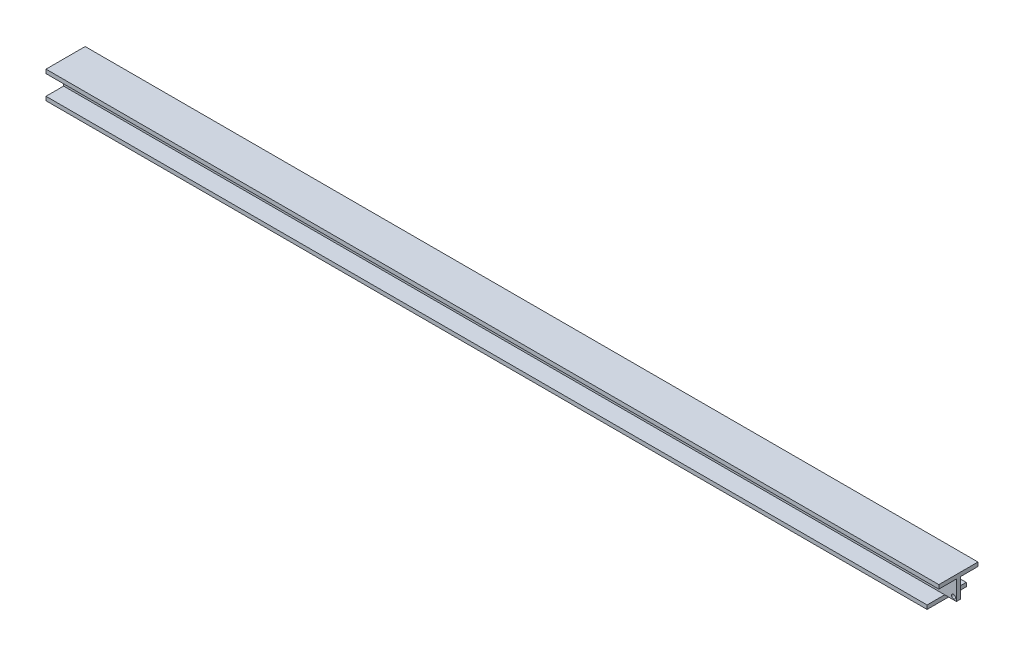
ISO-10303-21;
HEADER;
FILE_DESCRIPTION(('STEP AP214'),'2;1');
FILE_NAME('part.step','',(''),(''),'','','');
FILE_SCHEMA(('AUTOMOTIVE_DESIGN { 1 0 10303 214 1 1 1 1 }'));
ENDSEC;
DATA;
#1=APPLICATION_CONTEXT('core data for automotive mechanical design processes');
#2=APPLICATION_PROTOCOL_DEFINITION('international standard','automotive_design',2000,#1);
#3=PRODUCT_CONTEXT('',#1,'mechanical');
#4=PRODUCT('Part','Part','',(#3));
#5=PRODUCT_RELATED_PRODUCT_CATEGORY('part','',(#4));
#6=PRODUCT_DEFINITION_FORMATION('','',#4);
#7=PRODUCT_DEFINITION_CONTEXT('part definition',#1,'design');
#8=PRODUCT_DEFINITION('design','',#6,#7);
#9=PRODUCT_DEFINITION_SHAPE('','',#8);
#10=(LENGTH_UNIT() NAMED_UNIT(*) SI_UNIT(.MILLI.,.METRE.));
#11=(NAMED_UNIT(*) PLANE_ANGLE_UNIT() SI_UNIT($,.RADIAN.));
#12=(NAMED_UNIT(*) SI_UNIT($,.STERADIAN.) SOLID_ANGLE_UNIT());
#13=UNCERTAINTY_MEASURE_WITH_UNIT(LENGTH_MEASURE(1.E-05),#10,'distance_accuracy_value','');
#14=(GEOMETRIC_REPRESENTATION_CONTEXT(3) GLOBAL_UNCERTAINTY_ASSIGNED_CONTEXT((#13)) GLOBAL_UNIT_ASSIGNED_CONTEXT((#10,
#11,#12)) REPRESENTATION_CONTEXT('',''));
#15=CARTESIAN_POINT('',(0.,0.,0.));
#16=DIRECTION('',(0.,0.,1.));
#17=DIRECTION('',(1.,0.,0.));
#18=AXIS2_PLACEMENT_3D('',#15,#16,#17);
#19=CARTESIAN_POINT('',(1930.4,-127.,0.));
#20=DIRECTION('',(0.,-1.,0.));
#21=DIRECTION('',(0.,0.,-1.));
#22=AXIS2_PLACEMENT_3D('',#19,#20,#21);
#23=PLANE('',#22);
#24=DIRECTION('',(0.,0.,1.));
#25=VECTOR('',#24,1.);
#26=CARTESIAN_POINT('',(1854.2,-127.,0.));
#27=LINE('',#26,#25);
#28=CARTESIAN_POINT('',(1854.2,-127.,-114.3));
#29=VERTEX_POINT('',#28);
#30=CARTESIAN_POINT('',(1854.2,-127.,0.));
#31=VERTEX_POINT('',#30);
#32=EDGE_CURVE('E187',#29,#31,#27,.T.);
#33=ORIENTED_EDGE('',*,*,#32,.F.);
#34=DIRECTION('',(-1.,0.,0.));
#35=VECTOR('',#34,1.);
#36=CARTESIAN_POINT('',(1930.4,-127.,-114.3));
#37=LINE('',#36,#35);
#38=CARTESIAN_POINT('',(-3860.8,-127.,-114.3));
#39=VERTEX_POINT('',#38);
#40=EDGE_CURVE('E227',#29,#39,#37,.T.);
#41=ORIENTED_EDGE('',*,*,#40,.T.);
#42=DIRECTION('',(0.,0.,-1.));
#43=VECTOR('',#42,1.);
#44=CARTESIAN_POINT('',(-3860.8,-127.,-114.3));
#45=LINE('',#44,#43);
#46=CARTESIAN_POINT('',(-3860.8,-127.,0.));
#47=VERTEX_POINT('',#46);
#48=EDGE_CURVE('E169',#47,#39,#45,.T.);
#49=ORIENTED_EDGE('',*,*,#48,.F.);
#50=DIRECTION('',(-1.,0.,0.));
#51=VECTOR('',#50,1.);
#52=CARTESIAN_POINT('',(1930.4,-127.,0.));
#53=LINE('',#52,#51);
#54=EDGE_CURVE('E225',#31,#47,#53,.T.);
#55=ORIENTED_EDGE('',*,*,#54,.F.);
#56=EDGE_LOOP('',(#33,#41,#49,#55));
#57=FACE_BOUND('',#56,.T.);
#58=ADVANCED_FACE('F35',(#57),#23,.F.);
#59=CARTESIAN_POINT('',(1930.4,-127.,0.));
#60=DIRECTION('',(0.,0.,-1.));
#61=DIRECTION('',(0.,1.,0.));
#62=AXIS2_PLACEMENT_3D('',#59,#60,#61);
#63=PLANE('',#62);
#64=DIRECTION('',(0.,-1.,0.));
#65=VECTOR('',#64,1.);
#66=CARTESIAN_POINT('',(1854.2,-127.,0.));
#67=LINE('',#66,#65);
#68=CARTESIAN_POINT('',(1854.2,-152.4,0.));
#69=VERTEX_POINT('',#68);
#70=EDGE_CURVE('E181',#31,#69,#67,.T.);
#71=ORIENTED_EDGE('',*,*,#70,.F.);
#72=ORIENTED_EDGE('',*,*,#54,.T.);
#73=DIRECTION('',(0.,1.,0.));
#74=VECTOR('',#73,1.);
#75=CARTESIAN_POINT('',(-3860.8,-127.,0.));
#76=LINE('',#75,#74);
#77=CARTESIAN_POINT('',(-3860.8,-152.4,0.));
#78=VERTEX_POINT('',#77);
#79=EDGE_CURVE('E166',#78,#47,#76,.T.);
#80=ORIENTED_EDGE('',*,*,#79,.F.);
#81=DIRECTION('',(-1.,0.,0.));
#82=VECTOR('',#81,1.);
#83=CARTESIAN_POINT('',(1930.4,-152.4,0.));
#84=LINE('',#83,#82);
#85=EDGE_CURVE('E223',#69,#78,#84,.T.);
#86=ORIENTED_EDGE('',*,*,#85,.F.);
#87=EDGE_LOOP('',(#71,#72,#80,#86));
#88=FACE_BOUND('',#87,.T.);
#89=ADVANCED_FACE('F254',(#88),#63,.F.);
#90=CARTESIAN_POINT('',(1930.4,-152.4,0.));
#91=DIRECTION('',(0.,1.,0.));
#92=DIRECTION('',(0.,0.,1.));
#93=AXIS2_PLACEMENT_3D('',#90,#91,#92);
#94=PLANE('',#93);
#95=DIRECTION('',(0.,0.,-1.));
#96=VECTOR('',#95,1.);
#97=CARTESIAN_POINT('',(1854.2,-152.4,0.));
#98=LINE('',#97,#96);
#99=CARTESIAN_POINT('',(1854.2,-152.4,-254.));
#100=VERTEX_POINT('',#99);
#101=EDGE_CURVE('E183',#69,#100,#98,.T.);
#102=ORIENTED_EDGE('',*,*,#101,.F.);
#103=ORIENTED_EDGE('',*,*,#85,.T.);
#104=DIRECTION('',(0.,0.,1.));
#105=VECTOR('',#104,1.);
#106=CARTESIAN_POINT('',(-3860.8,-152.4,0.));
#107=LINE('',#106,#105);
#108=CARTESIAN_POINT('',(-3860.8,-152.4,-254.));
#109=VERTEX_POINT('',#108);
#110=EDGE_CURVE('E163',#109,#78,#107,.T.);
#111=ORIENTED_EDGE('',*,*,#110,.F.);
#112=DIRECTION('',(-1.,0.,0.));
#113=VECTOR('',#112,1.);
#114=CARTESIAN_POINT('',(1930.4,-152.4,-254.));
#115=LINE('',#114,#113);
#116=EDGE_CURVE('E221',#100,#109,#115,.T.);
#117=ORIENTED_EDGE('',*,*,#116,.F.);
#118=EDGE_LOOP('',(#102,#103,#111,#117));
#119=FACE_BOUND('',#118,.T.);
#120=ADVANCED_FACE('F261',(#119),#94,.F.);
#121=CARTESIAN_POINT('',(1930.4,-127.,-254.));
#122=DIRECTION('',(0.,0.,1.));
#123=DIRECTION('',(1.,0.,0.));
#124=AXIS2_PLACEMENT_3D('',#121,#122,#123);
#125=PLANE('',#124);
#126=DIRECTION('',(0.,1.,0.));
#127=VECTOR('',#126,1.);
#128=CARTESIAN_POINT('',(1854.2,-127.,-254.));
#129=LINE('',#128,#127);
#130=CARTESIAN_POINT('',(1854.2,-127.,-254.));
#131=VERTEX_POINT('',#130);
#132=EDGE_CURVE('E185',#100,#131,#129,.T.);
#133=ORIENTED_EDGE('',*,*,#132,.F.);
#134=ORIENTED_EDGE('',*,*,#116,.T.);
#135=DIRECTION('',(0.,-1.,0.));
#136=VECTOR('',#135,1.);
#137=CARTESIAN_POINT('',(-3860.8,-152.4,-254.));
#138=LINE('',#137,#136);
#139=CARTESIAN_POINT('',(-3860.8,-127.,-254.));
#140=VERTEX_POINT('',#139);
#141=EDGE_CURVE('E160',#140,#109,#138,.T.);
#142=ORIENTED_EDGE('',*,*,#141,.F.);
#143=DIRECTION('',(-1.,0.,0.));
#144=VECTOR('',#143,1.);
#145=CARTESIAN_POINT('',(1930.4,-127.,-254.));
#146=LINE('',#145,#144);
#147=EDGE_CURVE('E219',#131,#140,#146,.T.);
#148=ORIENTED_EDGE('',*,*,#147,.F.);
#149=EDGE_LOOP('',(#133,#134,#142,#148));
#150=FACE_BOUND('',#149,.T.);
#151=ADVANCED_FACE('F279',(#150),#125,.F.);
#152=CARTESIAN_POINT('',(1930.4,-127.,-139.7));
#153=DIRECTION('',(0.,-1.,0.));
#154=DIRECTION('',(0.,0.,-1.));
#155=AXIS2_PLACEMENT_3D('',#152,#153,#154);
#156=PLANE('',#155);
#157=CARTESIAN_POINT('',(1854.2,-127.,-139.7));
#158=VERTEX_POINT('',#157);
#159=EDGE_CURVE('E188',#131,#158,#27,.T.);
#160=ORIENTED_EDGE('',*,*,#159,.F.);
#161=ORIENTED_EDGE('',*,*,#147,.T.);
#162=DIRECTION('',(0.,0.,-1.));
#163=VECTOR('',#162,1.);
#164=CARTESIAN_POINT('',(-3860.8,-127.,-254.));
#165=LINE('',#164,#163);
#166=CARTESIAN_POINT('',(-3860.8,-127.,-139.7));
#167=VERTEX_POINT('',#166);
#168=EDGE_CURVE('E157',#167,#140,#165,.T.);
#169=ORIENTED_EDGE('',*,*,#168,.F.);
#170=DIRECTION('',(-1.,0.,0.));
#171=VECTOR('',#170,1.);
#172=CARTESIAN_POINT('',(1930.4,-127.,-139.7));
#173=LINE('',#172,#171);
#174=EDGE_CURVE('E215',#158,#167,#173,.T.);
#175=ORIENTED_EDGE('',*,*,#174,.F.);
#176=EDGE_LOOP('',(#160,#161,#169,#175));
#177=FACE_BOUND('',#176,.T.);
#178=ADVANCED_FACE('F275',(#177),#156,.F.);
#179=CARTESIAN_POINT('',(1930.4,0.,0.));
#180=DIRECTION('',(0.,0.,-1.));
#181=DIRECTION('',(-1.,0.,0.));
#182=AXIS2_PLACEMENT_3D('',#179,#180,#181);
#183=PLANE('',#182);
#184=DIRECTION('',(-1.,0.,0.));
#185=VECTOR('',#184,1.);
#186=CARTESIAN_POINT('',(1930.4,25.4,0.));
#187=LINE('',#186,#185);
#188=CARTESIAN_POINT('',(1930.4,25.4,0.));
#189=VERTEX_POINT('',#188);
#190=CARTESIAN_POINT('',(-3860.8,25.4,0.));
#191=VERTEX_POINT('',#190);
#192=EDGE_CURVE('E211',#189,#191,#187,.T.);
#193=ORIENTED_EDGE('',*,*,#192,.T.);
#194=DIRECTION('',(0.,1.,0.));
#195=VECTOR('',#194,1.);
#196=CARTESIAN_POINT('',(-3860.8,25.4,0.));
#197=LINE('',#196,#195);
#198=CARTESIAN_POINT('',(-3860.8,0.,0.));
#199=VERTEX_POINT('',#198);
#200=EDGE_CURVE('E178',#199,#191,#197,.T.);
#201=ORIENTED_EDGE('',*,*,#200,.F.);
#202=DIRECTION('',(-1.,0.,0.));
#203=VECTOR('',#202,1.);
#204=CARTESIAN_POINT('',(1930.4,0.,0.));
#205=LINE('',#204,#203);
#206=CARTESIAN_POINT('',(1930.4,0.,0.));
#207=VERTEX_POINT('',#206);
#208=EDGE_CURVE('E43',#207,#199,#205,.T.);
#209=ORIENTED_EDGE('',*,*,#208,.F.);
#210=DIRECTION('',(0.,-1.,0.));
#211=VECTOR('',#210,1.);
#212=CARTESIAN_POINT('',(1930.4,0.,0.));
#213=LINE('',#212,#211);
#214=EDGE_CURVE('E198',#189,#207,#213,.T.);
#215=ORIENTED_EDGE('',*,*,#214,.F.);
#216=EDGE_LOOP('',(#193,#201,#209,#215));
#217=FACE_BOUND('',#216,.T.);
#218=ADVANCED_FACE('F37',(#217),#183,.F.);
#219=CARTESIAN_POINT('',(1930.4,0.,0.));
#220=DIRECTION('',(0.,1.,0.));
#221=DIRECTION('',(0.,0.,1.));
#222=AXIS2_PLACEMENT_3D('',#219,#220,#221);
#223=PLANE('',#222);
#224=ORIENTED_EDGE('',*,*,#208,.T.);
#225=DIRECTION('',(0.,0.,1.));
#226=VECTOR('',#225,1.);
#227=CARTESIAN_POINT('',(-3860.8,0.,0.));
#228=LINE('',#227,#226);
#229=CARTESIAN_POINT('',(-3860.8,0.,-114.3));
#230=VERTEX_POINT('',#229);
#231=EDGE_CURVE('E175',#230,#199,#228,.T.);
#232=ORIENTED_EDGE('',*,*,#231,.F.);
#233=DIRECTION('',(-1.,0.,0.));
#234=VECTOR('',#233,1.);
#235=CARTESIAN_POINT('',(1930.4,0.,-114.3));
#236=LINE('',#235,#234);
#237=CARTESIAN_POINT('',(1930.4,0.,-114.3));
#238=VERTEX_POINT('',#237);
#239=EDGE_CURVE('E230',#238,#230,#236,.T.);
#240=ORIENTED_EDGE('',*,*,#239,.F.);
#241=DIRECTION('',(0.,0.,-1.));
#242=VECTOR('',#241,1.);
#243=CARTESIAN_POINT('',(1930.4,0.,0.));
#244=LINE('',#243,#242);
#245=EDGE_CURVE('E200',#207,#238,#244,.T.);
#246=ORIENTED_EDGE('',*,*,#245,.F.);
#247=EDGE_LOOP('',(#224,#232,#240,#246));
#248=FACE_BOUND('',#247,.T.);
#249=ADVANCED_FACE('F234',(#248),#223,.F.);
#250=CARTESIAN_POINT('',(1930.4,0.,-114.3));
#251=DIRECTION('',(0.,0.,-1.));
#252=DIRECTION('',(-1.,0.,0.));
#253=AXIS2_PLACEMENT_3D('',#250,#251,#252);
#254=PLANE('',#253);
#255=CARTESIAN_POINT('',(1911.35,-107.95,-114.3));
#256=DIRECTION('',(0.,0.,1.));
#257=DIRECTION('',(1.,0.,0.));
#258=AXIS2_PLACEMENT_3D('',#255,#256,#257);
#259=CIRCLE('',#258,12.6999999999994);
#260=CARTESIAN_POINT('',(1924.05,-107.95,-114.3));
#261=VERTEX_POINT('',#260);
#262=EDGE_CURVE('E191',#261,#261,#259,.T.);
#263=ORIENTED_EDGE('',*,*,#262,.F.);
#264=EDGE_LOOP('',(#263));
#265=FACE_BOUND('',#264,.T.);
#266=ORIENTED_EDGE('',*,*,#239,.T.);
#267=DIRECTION('',(0.,1.,0.));
#268=VECTOR('',#267,1.);
#269=CARTESIAN_POINT('',(-3860.8,0.,-114.3));
#270=LINE('',#269,#268);
#271=EDGE_CURVE('E172',#39,#230,#270,.T.);
#272=ORIENTED_EDGE('',*,*,#271,.F.);
#273=ORIENTED_EDGE('',*,*,#40,.F.);
#274=CARTESIAN_POINT('',(1930.4,-127.,-114.3));
#275=VERTEX_POINT('',#274);
#276=EDGE_CURVE('E228',#275,#29,#37,.T.);
#277=ORIENTED_EDGE('',*,*,#276,.F.);
#278=DIRECTION('',(0.,-1.,0.));
#279=VECTOR('',#278,1.);
#280=CARTESIAN_POINT('',(1930.4,0.,-114.3));
#281=LINE('',#280,#279);
#282=EDGE_CURVE('E202',#238,#275,#281,.T.);
#283=ORIENTED_EDGE('',*,*,#282,.F.);
#284=EDGE_LOOP('',(#266,#272,#273,#277,#283));
#285=FACE_BOUND('',#284,.T.);
#286=ADVANCED_FACE('F267',(#265,#285),#254,.F.);
#287=CARTESIAN_POINT('',(1930.4,0.,-139.7));
#288=DIRECTION('',(0.,0.,1.));
#289=DIRECTION('',(1.,0.,0.));
#290=AXIS2_PLACEMENT_3D('',#287,#288,#289);
#291=PLANE('',#290);
#292=CARTESIAN_POINT('',(1911.35,-107.95,-139.7));
#293=DIRECTION('',(0.,0.,1.));
#294=DIRECTION('',(1.,0.,0.));
#295=AXIS2_PLACEMENT_3D('',#292,#293,#294);
#296=CIRCLE('',#295,12.6999999999994);
#297=CARTESIAN_POINT('',(1924.05,-107.95,-139.7));
#298=VERTEX_POINT('',#297);
#299=EDGE_CURVE('E195',#298,#298,#296,.F.);
#300=ORIENTED_EDGE('',*,*,#299,.F.);
#301=EDGE_LOOP('',(#300));
#302=FACE_BOUND('',#301,.T.);
#303=ORIENTED_EDGE('',*,*,#174,.T.);
#304=DIRECTION('',(0.,-1.,0.));
#305=VECTOR('',#304,1.);
#306=CARTESIAN_POINT('',(-3860.8,-127.,-139.7));
#307=LINE('',#306,#305);
#308=CARTESIAN_POINT('',(-3860.8,0.,-139.7));
#309=VERTEX_POINT('',#308);
#310=EDGE_CURVE('E147',#309,#167,#307,.T.);
#311=ORIENTED_EDGE('',*,*,#310,.F.);
#312=DIRECTION('',(-1.,0.,0.));
#313=VECTOR('',#312,1.);
#314=CARTESIAN_POINT('',(1930.4,0.,-139.7));
#315=LINE('',#314,#313);
#316=CARTESIAN_POINT('',(1930.4,0.,-139.7));
#317=VERTEX_POINT('',#316);
#318=EDGE_CURVE('E137',#317,#309,#315,.T.);
#319=ORIENTED_EDGE('',*,*,#318,.F.);
#320=DIRECTION('',(0.,1.,0.));
#321=VECTOR('',#320,1.);
#322=CARTESIAN_POINT('',(1930.4,0.,-139.7));
#323=LINE('',#322,#321);
#324=CARTESIAN_POINT('',(1930.4,-127.,-139.7));
#325=VERTEX_POINT('',#324);
#326=EDGE_CURVE('E205',#325,#317,#323,.T.);
#327=ORIENTED_EDGE('',*,*,#326,.F.);
#328=EDGE_CURVE('E216',#325,#158,#173,.T.);
#329=ORIENTED_EDGE('',*,*,#328,.T.);
#330=EDGE_LOOP('',(#303,#311,#319,#327,#329));
#331=FACE_BOUND('',#330,.T.);
#332=ADVANCED_FACE('F269',(#302,#331),#291,.F.);
#333=CARTESIAN_POINT('',(1930.4,0.,-139.7));
#334=DIRECTION('',(0.,1.,0.));
#335=DIRECTION('',(0.,0.,1.));
#336=AXIS2_PLACEMENT_3D('',#333,#334,#335);
#337=PLANE('',#336);
#338=ORIENTED_EDGE('',*,*,#318,.T.);
#339=DIRECTION('',(0.,0.,1.));
#340=VECTOR('',#339,1.);
#341=CARTESIAN_POINT('',(-3860.8,0.,-139.7));
#342=LINE('',#341,#340);
#343=CARTESIAN_POINT('',(-3860.8,0.,-254.));
#344=VERTEX_POINT('',#343);
#345=EDGE_CURVE('E141',#344,#309,#342,.T.);
#346=ORIENTED_EDGE('',*,*,#345,.F.);
#347=DIRECTION('',(-1.,0.,0.));
#348=VECTOR('',#347,1.);
#349=CARTESIAN_POINT('',(1930.4,0.,-254.));
#350=LINE('',#349,#348);
#351=CARTESIAN_POINT('',(1930.4,0.,-254.));
#352=VERTEX_POINT('',#351);
#353=EDGE_CURVE('E130',#352,#344,#350,.T.);
#354=ORIENTED_EDGE('',*,*,#353,.F.);
#355=DIRECTION('',(0.,0.,-1.));
#356=VECTOR('',#355,1.);
#357=CARTESIAN_POINT('',(1930.4,0.,-139.7));
#358=LINE('',#357,#356);
#359=EDGE_CURVE('E207',#317,#352,#358,.T.);
#360=ORIENTED_EDGE('',*,*,#359,.F.);
#361=EDGE_LOOP('',(#338,#346,#354,#360));
#362=FACE_BOUND('',#361,.T.);
#363=ADVANCED_FACE('F142',(#362),#337,.F.);
#364=CARTESIAN_POINT('',(1930.4,0.,-254.));
#365=DIRECTION('',(0.,0.,1.));
#366=DIRECTION('',(1.,0.,0.));
#367=AXIS2_PLACEMENT_3D('',#364,#365,#366);
#368=PLANE('',#367);
#369=ORIENTED_EDGE('',*,*,#353,.T.);
#370=DIRECTION('',(0.,-1.,0.));
#371=VECTOR('',#370,1.);
#372=CARTESIAN_POINT('',(-3860.8,0.,-254.));
#373=LINE('',#372,#371);
#374=CARTESIAN_POINT('',(-3860.8,25.4,-254.));
#375=VERTEX_POINT('',#374);
#376=EDGE_CURVE('E134',#375,#344,#373,.T.);
#377=ORIENTED_EDGE('',*,*,#376,.F.);
#378=DIRECTION('',(-1.,0.,0.));
#379=VECTOR('',#378,1.);
#380=CARTESIAN_POINT('',(1930.4,25.4,-254.));
#381=LINE('',#380,#379);
#382=CARTESIAN_POINT('',(1930.4,25.4,-254.));
#383=VERTEX_POINT('',#382);
#384=EDGE_CURVE('E138',#383,#375,#381,.T.);
#385=ORIENTED_EDGE('',*,*,#384,.F.);
#386=DIRECTION('',(0.,1.,0.));
#387=VECTOR('',#386,1.);
#388=CARTESIAN_POINT('',(1930.4,0.,-254.));
#389=LINE('',#388,#387);
#390=EDGE_CURVE('E55',#352,#383,#389,.T.);
#391=ORIENTED_EDGE('',*,*,#390,.F.);
#392=EDGE_LOOP('',(#369,#377,#385,#391));
#393=FACE_BOUND('',#392,.T.);
#394=ADVANCED_FACE('F132',(#393),#368,.F.);
#395=CARTESIAN_POINT('',(1930.4,25.4,0.));
#396=DIRECTION('',(0.,-1.,0.));
#397=DIRECTION('',(0.,0.,-1.));
#398=AXIS2_PLACEMENT_3D('',#395,#396,#397);
#399=PLANE('',#398);
#400=ORIENTED_EDGE('',*,*,#384,.T.);
#401=DIRECTION('',(0.,0.,-1.));
#402=VECTOR('',#401,1.);
#403=CARTESIAN_POINT('',(-3860.8,25.4,-254.));
#404=LINE('',#403,#402);
#405=EDGE_CURVE('E153',#191,#375,#404,.T.);
#406=ORIENTED_EDGE('',*,*,#405,.F.);
#407=ORIENTED_EDGE('',*,*,#192,.F.);
#408=DIRECTION('',(0.,0.,1.));
#409=VECTOR('',#408,1.);
#410=CARTESIAN_POINT('',(1930.4,25.4,0.));
#411=LINE('',#410,#409);
#412=EDGE_CURVE('E50',#383,#189,#411,.T.);
#413=ORIENTED_EDGE('',*,*,#412,.F.);
#414=EDGE_LOOP('',(#400,#406,#407,#413));
#415=FACE_BOUND('',#414,.T.);
#416=ADVANCED_FACE('F241',(#415),#399,.F.);
#417=CARTESIAN_POINT('',(1930.4,0.,0.));
#418=DIRECTION('',(-1.,0.,0.));
#419=DIRECTION('',(0.,0.,1.));
#420=AXIS2_PLACEMENT_3D('',#417,#418,#419);
#421=PLANE('',#420);
#422=ORIENTED_EDGE('',*,*,#282,.T.);
#423=DIRECTION('',(0.,0.,-1.));
#424=VECTOR('',#423,1.);
#425=CARTESIAN_POINT('',(1930.4,-127.,0.));
#426=LINE('',#425,#424);
#427=EDGE_CURVE('E11',#275,#325,#426,.T.);
#428=ORIENTED_EDGE('',*,*,#427,.T.);
#429=ORIENTED_EDGE('',*,*,#326,.T.);
#430=ORIENTED_EDGE('',*,*,#359,.T.);
#431=ORIENTED_EDGE('',*,*,#390,.T.);
#432=ORIENTED_EDGE('',*,*,#412,.T.);
#433=ORIENTED_EDGE('',*,*,#214,.T.);
#434=ORIENTED_EDGE('',*,*,#245,.T.);
#435=EDGE_LOOP('',(#422,#428,#429,#430,#431,#432,#433,#434));
#436=FACE_BOUND('',#435,.T.);
#437=ADVANCED_FACE('F243',(#436),#421,.F.);
#438=CARTESIAN_POINT('',(1911.35,-107.95,-254.001));
#439=DIRECTION('',(0.,0.,1.));
#440=DIRECTION('',(1.,0.,0.));
#441=AXIS2_PLACEMENT_3D('',#438,#439,#440);
#442=CYLINDRICAL_SURFACE('',#441,12.6999999999994);
#443=CARTESIAN_POINT('',(1924.05,-107.95,-114.3));
#444=CARTESIAN_POINT('',(1924.05,-107.95,-114.564583333333));
#445=CARTESIAN_POINT('',(1924.05,-107.95,-114.829166666667));
#446=CARTESIAN_POINT('',(1924.05,-107.95,-115.358333333333));
#447=CARTESIAN_POINT('',(1924.05,-107.95,-115.622916666667));
#448=CARTESIAN_POINT('',(1924.05,-107.95,-116.152083333333));
#449=CARTESIAN_POINT('',(1924.05,-107.95,-116.416666666667));
#450=CARTESIAN_POINT('',(1924.05,-107.95,-116.945833333333));
#451=CARTESIAN_POINT('',(1924.05,-107.95,-117.210416666667));
#452=CARTESIAN_POINT('',(1924.05,-107.95,-117.739583333333));
#453=CARTESIAN_POINT('',(1924.05,-107.95,-118.004166666667));
#454=CARTESIAN_POINT('',(1924.05,-107.95,-118.533333333333));
#455=CARTESIAN_POINT('',(1924.05,-107.95,-118.797916666667));
#456=CARTESIAN_POINT('',(1924.05,-107.95,-119.327083333333));
#457=CARTESIAN_POINT('',(1924.05,-107.95,-119.591666666667));
#458=CARTESIAN_POINT('',(1924.05,-107.95,-120.120833333333));
#459=CARTESIAN_POINT('',(1924.05,-107.95,-120.385416666667));
#460=CARTESIAN_POINT('',(1924.05,-107.95,-120.914583333333));
#461=CARTESIAN_POINT('',(1924.05,-107.95,-121.179166666667));
#462=CARTESIAN_POINT('',(1924.05,-107.95,-121.708333333333));
#463=CARTESIAN_POINT('',(1924.05,-107.95,-121.972916666667));
#464=CARTESIAN_POINT('',(1924.05,-107.95,-122.502083333333));
#465=CARTESIAN_POINT('',(1924.05,-107.95,-122.766666666667));
#466=CARTESIAN_POINT('',(1924.05,-107.95,-123.295833333333));
#467=CARTESIAN_POINT('',(1924.05,-107.95,-123.560416666667));
#468=CARTESIAN_POINT('',(1924.05,-107.95,-124.089583333333));
#469=CARTESIAN_POINT('',(1924.05,-107.95,-124.354166666667));
#470=CARTESIAN_POINT('',(1924.05,-107.95,-124.883333333333));
#471=CARTESIAN_POINT('',(1924.05,-107.95,-125.147916666667));
#472=CARTESIAN_POINT('',(1924.05,-107.95,-125.677083333333));
#473=CARTESIAN_POINT('',(1924.05,-107.95,-125.941666666667));
#474=CARTESIAN_POINT('',(1924.05,-107.95,-126.470833333333));
#475=CARTESIAN_POINT('',(1924.05,-107.95,-126.735416666667));
#476=CARTESIAN_POINT('',(1924.05,-107.95,-127.264583333333));
#477=CARTESIAN_POINT('',(1924.05,-107.95,-127.529166666667));
#478=CARTESIAN_POINT('',(1924.05,-107.95,-128.058333333333));
#479=CARTESIAN_POINT('',(1924.05,-107.95,-128.322916666667));
#480=CARTESIAN_POINT('',(1924.05,-107.95,-128.852083333333));
#481=CARTESIAN_POINT('',(1924.05,-107.95,-129.116666666667));
#482=CARTESIAN_POINT('',(1924.05,-107.95,-129.645833333333));
#483=CARTESIAN_POINT('',(1924.05,-107.95,-129.910416666667));
#484=CARTESIAN_POINT('',(1924.05,-107.95,-130.439583333333));
#485=CARTESIAN_POINT('',(1924.05,-107.95,-130.704166666667));
#486=CARTESIAN_POINT('',(1924.05,-107.95,-131.233333333333));
#487=CARTESIAN_POINT('',(1924.05,-107.95,-131.497916666667));
#488=CARTESIAN_POINT('',(1924.05,-107.95,-132.027083333333));
#489=CARTESIAN_POINT('',(1924.05,-107.95,-132.291666666667));
#490=CARTESIAN_POINT('',(1924.05,-107.95,-132.820833333333));
#491=CARTESIAN_POINT('',(1924.05,-107.95,-133.085416666667));
#492=CARTESIAN_POINT('',(1924.05,-107.95,-133.614583333333));
#493=CARTESIAN_POINT('',(1924.05,-107.95,-133.879166666667));
#494=CARTESIAN_POINT('',(1924.05,-107.95,-134.408333333333));
#495=CARTESIAN_POINT('',(1924.05,-107.95,-134.672916666667));
#496=CARTESIAN_POINT('',(1924.05,-107.95,-135.202083333333));
#497=CARTESIAN_POINT('',(1924.05,-107.95,-135.466666666667));
#498=CARTESIAN_POINT('',(1924.05,-107.95,-135.995833333333));
#499=CARTESIAN_POINT('',(1924.05,-107.95,-136.260416666667));
#500=CARTESIAN_POINT('',(1924.05,-107.95,-136.789583333333));
#501=CARTESIAN_POINT('',(1924.05,-107.95,-137.054166666667));
#502=CARTESIAN_POINT('',(1924.05,-107.95,-137.583333333333));
#503=CARTESIAN_POINT('',(1924.05,-107.95,-137.847916666667));
#504=CARTESIAN_POINT('',(1924.05,-107.95,-138.377083333333));
#505=CARTESIAN_POINT('',(1924.05,-107.95,-138.641666666667));
#506=CARTESIAN_POINT('',(1924.05,-107.95,-139.170833333333));
#507=CARTESIAN_POINT('',(1924.05,-107.95,-139.435416666667));
#508=CARTESIAN_POINT('',(1924.05,-107.95,-139.7));
#509=B_SPLINE_CURVE_WITH_KNOTS('',3,(#443,#444,#445,#446,#447,#448,#449,#450,#451,#452,#453,
#454,#455,#456,#457,#458,#459,#460,#461,#462,#463,#464,#465,#466,#467,#468,#469,#470,#471,#472,
#473,#474,#475,#476,#477,#478,#479,#480,#481,#482,#483,#484,#485,#486,#487,#488,#489,#490,#491,
#492,#493,#494,#495,#496,#497,#498,#499,#500,#501,#502,#503,#504,#505,#506,#507,#508),
.UNSPECIFIED.,.F.,.F.,(4,2,2,2,2,2,2,2,2,2,2,2,2,2,2,2,2,2,2,2,2,2,2,2,2,2,2,2,2,2,2,2,4),(0.,
0.79375000000001,1.58749999999999,2.38125,3.17500000000001,3.96874999999999,4.7625,
5.55625000000001,6.35000000000002,7.14375,7.93750000000001,8.73125000000002,9.52500000000001,
10.31875,11.1125,11.90625,12.7,13.49375,14.2875,15.08125,15.875,16.66875,17.4625,18.25625,19.05,
19.84375,20.6375,21.43125,22.225,23.01875,23.8125,24.60625,25.4),.UNSPECIFIED.);
#510=EDGE_CURVE('BSEAM250',#261,#298,#509,.T.);
#511=ORIENTED_EDGE('',*,*,#262,.T.);
#512=ORIENTED_EDGE('',*,*,#299,.T.);
#513=ORIENTED_EDGE('',*,*,#510,.T.);
#514=ORIENTED_EDGE('',*,*,#510,.F.);
#515=EDGE_LOOP('',(#511,#513,#512,#514));
#516=FACE_BOUND('',#515,.T.);
#517=ADVANCED_FACE('F250',(#516),#442,.F.);
#518=CARTESIAN_POINT('',(1854.2,-127.,0.));
#519=DIRECTION('',(0.,1.,0.));
#520=DIRECTION('',(0.,0.,1.));
#521=AXIS2_PLACEMENT_3D('',#518,#519,#520);
#522=PLANE('',#521);
#523=EDGE_CURVE('E192',#158,#29,#27,.T.);
#524=ORIENTED_EDGE('',*,*,#523,.F.);
#525=ORIENTED_EDGE('',*,*,#328,.F.);
#526=ORIENTED_EDGE('',*,*,#427,.F.);
#527=ORIENTED_EDGE('',*,*,#276,.T.);
#528=EDGE_LOOP('',(#524,#525,#526,#527));
#529=FACE_BOUND('',#528,.T.);
#530=ADVANCED_FACE('F317',(#529),#522,.F.);
#531=CARTESIAN_POINT('',(1854.2,0.,0.));
#532=DIRECTION('',(1.,0.,0.));
#533=DIRECTION('',(0.,0.,-1.));
#534=AXIS2_PLACEMENT_3D('',#531,#532,#533);
#535=PLANE('',#534);
#536=ORIENTED_EDGE('',*,*,#70,.T.);
#537=ORIENTED_EDGE('',*,*,#101,.T.);
#538=ORIENTED_EDGE('',*,*,#132,.T.);
#539=ORIENTED_EDGE('',*,*,#159,.T.);
#540=ORIENTED_EDGE('',*,*,#523,.T.);
#541=ORIENTED_EDGE('',*,*,#32,.T.);
#542=EDGE_LOOP('',(#536,#537,#538,#539,#540,#541));
#543=FACE_BOUND('',#542,.T.);
#544=ADVANCED_FACE('F315',(#543),#535,.T.);
#545=CARTESIAN_POINT('',(-3860.8,0.,0.));
#546=DIRECTION('',(1.,0.,0.));
#547=DIRECTION('',(0.,0.,-1.));
#548=AXIS2_PLACEMENT_3D('',#545,#546,#547);
#549=PLANE('',#548);
#550=ORIENTED_EDGE('',*,*,#376,.T.);
#551=ORIENTED_EDGE('',*,*,#345,.T.);
#552=ORIENTED_EDGE('',*,*,#310,.T.);
#553=ORIENTED_EDGE('',*,*,#168,.T.);
#554=ORIENTED_EDGE('',*,*,#141,.T.);
#555=ORIENTED_EDGE('',*,*,#110,.T.);
#556=ORIENTED_EDGE('',*,*,#79,.T.);
#557=ORIENTED_EDGE('',*,*,#48,.T.);
#558=ORIENTED_EDGE('',*,*,#271,.T.);
#559=ORIENTED_EDGE('',*,*,#231,.T.);
#560=ORIENTED_EDGE('',*,*,#200,.T.);
#561=ORIENTED_EDGE('',*,*,#405,.T.);
#562=EDGE_LOOP('',(#550,#551,#552,#553,#554,#555,#556,#557,#558,#559,#560,#561));
#563=FACE_BOUND('',#562,.T.);
#564=ADVANCED_FACE('F150',(#563),#549,.F.);
#565=CLOSED_SHELL('',(#58,#89,#120,#151,#178,#218,#249,#286,#332,#363,#394,#416,#437,#517,#530,
#544,#564));
#566=MANIFOLD_SOLID_BREP('B2',#565);
#567=ADVANCED_BREP_SHAPE_REPRESENTATION('',(#18,#566),#14);
#568=SHAPE_DEFINITION_REPRESENTATION(#9,#567);
ENDSEC;
END-ISO-10303-21;
